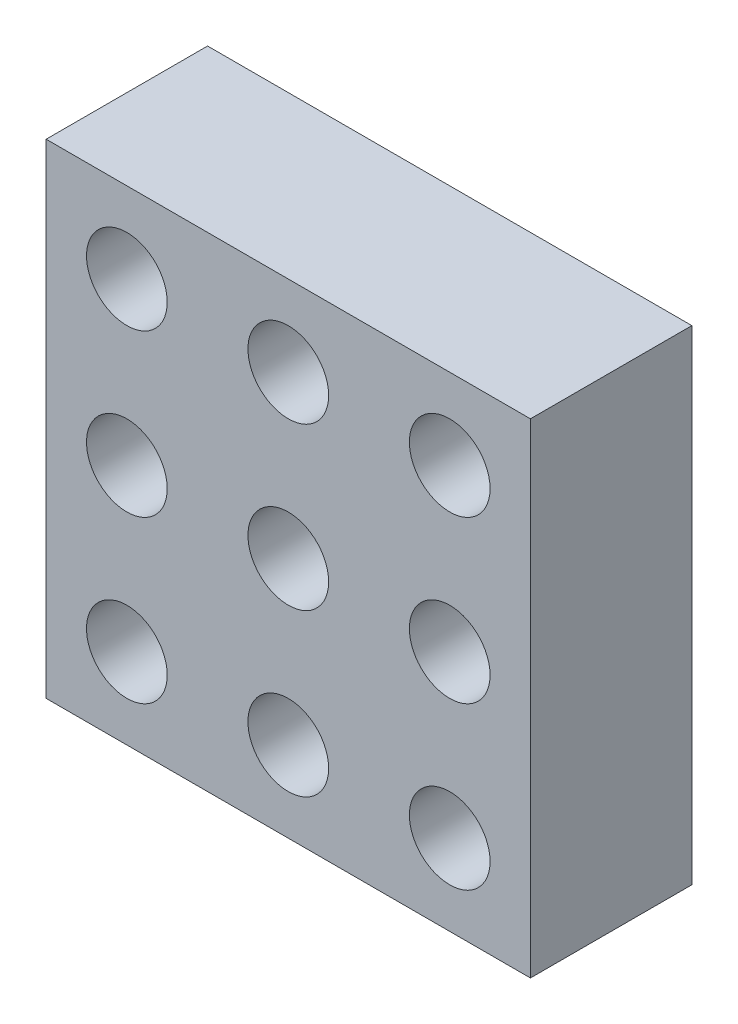
ISO-10303-21;
HEADER;
FILE_DESCRIPTION(('STEP AP214'),'2;1');
FILE_NAME('part.step','',(''),(''),'','','');
FILE_SCHEMA(('AUTOMOTIVE_DESIGN { 1 0 10303 214 1 1 1 1 }'));
ENDSEC;
DATA;
#1=APPLICATION_CONTEXT('core data for automotive mechanical design processes');
#2=APPLICATION_PROTOCOL_DEFINITION('international standard','automotive_design',2000,#1);
#3=PRODUCT_CONTEXT('',#1,'mechanical');
#4=PRODUCT('Part','Part','',(#3));
#5=PRODUCT_RELATED_PRODUCT_CATEGORY('part','',(#4));
#6=PRODUCT_DEFINITION_FORMATION('','',#4);
#7=PRODUCT_DEFINITION_CONTEXT('part definition',#1,'design');
#8=PRODUCT_DEFINITION('design','',#6,#7);
#9=PRODUCT_DEFINITION_SHAPE('','',#8);
#10=(LENGTH_UNIT() NAMED_UNIT(*) SI_UNIT(.MILLI.,.METRE.));
#11=(NAMED_UNIT(*) PLANE_ANGLE_UNIT() SI_UNIT($,.RADIAN.));
#12=(NAMED_UNIT(*) SI_UNIT($,.STERADIAN.) SOLID_ANGLE_UNIT());
#13=UNCERTAINTY_MEASURE_WITH_UNIT(LENGTH_MEASURE(1.E-05),#10,'distance_accuracy_value','');
#14=(GEOMETRIC_REPRESENTATION_CONTEXT(3) GLOBAL_UNCERTAINTY_ASSIGNED_CONTEXT((#13)) GLOBAL_UNIT_ASSIGNED_CONTEXT((#10,
#11,#12)) REPRESENTATION_CONTEXT('',''));
#15=CARTESIAN_POINT('',(0.,0.,0.));
#16=DIRECTION('',(0.,0.,1.));
#17=DIRECTION('',(1.,0.,0.));
#18=AXIS2_PLACEMENT_3D('',#15,#16,#17);
#19=CARTESIAN_POINT('',(63.5,63.5,0.));
#20=DIRECTION('',(0.,0.,1.));
#21=DIRECTION('',(1.,0.,0.));
#22=AXIS2_PLACEMENT_3D('',#19,#20,#21);
#23=CYLINDRICAL_SURFACE('',#22,6.35);
#24=CARTESIAN_POINT('',(63.5,63.5,0.));
#25=DIRECTION('',(0.,0.,1.));
#26=DIRECTION('',(1.,0.,0.));
#27=AXIS2_PLACEMENT_3D('',#24,#25,#26);
#28=CIRCLE('',#27,6.35);
#29=CARTESIAN_POINT('',(69.85,63.5,0.));
#30=VERTEX_POINT('',#29);
#31=EDGE_CURVE('E47',#30,#30,#28,.T.);
#32=ORIENTED_EDGE('',*,*,#31,.F.);
#33=EDGE_LOOP('',(#32));
#34=FACE_BOUND('',#33,.T.);
#35=CARTESIAN_POINT('',(63.5,63.5,25.4));
#36=DIRECTION('',(0.,0.,1.));
#37=DIRECTION('',(1.,0.,0.));
#38=AXIS2_PLACEMENT_3D('',#35,#36,#37);
#39=CIRCLE('',#38,6.35);
#40=CARTESIAN_POINT('',(69.85,63.5,25.4));
#41=VERTEX_POINT('',#40);
#42=EDGE_CURVE('E11',#41,#41,#39,.T.);
#43=ORIENTED_EDGE('',*,*,#42,.T.);
#44=EDGE_LOOP('',(#43));
#45=FACE_BOUND('',#44,.T.);
#46=ADVANCED_FACE('F39',(#34,#45),#23,.F.);
#47=CARTESIAN_POINT('',(63.5,38.1,0.));
#48=DIRECTION('',(0.,0.,1.));
#49=DIRECTION('',(1.,0.,0.));
#50=AXIS2_PLACEMENT_3D('',#47,#48,#49);
#51=CYLINDRICAL_SURFACE('',#50,6.35);
#52=CARTESIAN_POINT('',(63.5,38.1,0.));
#53=DIRECTION('',(0.,0.,1.));
#54=DIRECTION('',(1.,0.,0.));
#55=AXIS2_PLACEMENT_3D('',#52,#53,#54);
#56=CIRCLE('',#55,6.35);
#57=CARTESIAN_POINT('',(69.85,38.1,0.));
#58=VERTEX_POINT('',#57);
#59=EDGE_CURVE('E147',#58,#58,#56,.T.);
#60=ORIENTED_EDGE('',*,*,#59,.F.);
#61=EDGE_LOOP('',(#60));
#62=FACE_BOUND('',#61,.T.);
#63=CARTESIAN_POINT('',(63.5,38.1,25.4));
#64=DIRECTION('',(0.,0.,1.));
#65=DIRECTION('',(1.,0.,0.));
#66=AXIS2_PLACEMENT_3D('',#63,#64,#65);
#67=CIRCLE('',#66,6.35);
#68=CARTESIAN_POINT('',(69.85,38.1,25.4));
#69=VERTEX_POINT('',#68);
#70=EDGE_CURVE('E150',#69,#69,#67,.T.);
#71=ORIENTED_EDGE('',*,*,#70,.T.);
#72=EDGE_LOOP('',(#71));
#73=FACE_BOUND('',#72,.T.);
#74=ADVANCED_FACE('F159',(#62,#73),#51,.F.);
#75=CARTESIAN_POINT('',(63.5,12.7,0.));
#76=DIRECTION('',(0.,0.,1.));
#77=DIRECTION('',(1.,0.,0.));
#78=AXIS2_PLACEMENT_3D('',#75,#76,#77);
#79=CYLINDRICAL_SURFACE('',#78,6.35);
#80=CARTESIAN_POINT('',(63.5,12.7,0.));
#81=DIRECTION('',(0.,0.,1.));
#82=DIRECTION('',(1.,0.,0.));
#83=AXIS2_PLACEMENT_3D('',#80,#81,#82);
#84=CIRCLE('',#83,6.35);
#85=CARTESIAN_POINT('',(69.85,12.7,0.));
#86=VERTEX_POINT('',#85);
#87=EDGE_CURVE('E141',#86,#86,#84,.T.);
#88=ORIENTED_EDGE('',*,*,#87,.F.);
#89=EDGE_LOOP('',(#88));
#90=FACE_BOUND('',#89,.T.);
#91=CARTESIAN_POINT('',(63.5,12.7,25.4));
#92=DIRECTION('',(0.,0.,1.));
#93=DIRECTION('',(1.,0.,0.));
#94=AXIS2_PLACEMENT_3D('',#91,#92,#93);
#95=CIRCLE('',#94,6.35);
#96=CARTESIAN_POINT('',(69.85,12.7,25.4));
#97=VERTEX_POINT('',#96);
#98=EDGE_CURVE('E144',#97,#97,#95,.T.);
#99=ORIENTED_EDGE('',*,*,#98,.T.);
#100=EDGE_LOOP('',(#99));
#101=FACE_BOUND('',#100,.T.);
#102=ADVANCED_FACE('F202',(#90,#101),#79,.F.);
#103=CARTESIAN_POINT('',(38.1,63.5,0.));
#104=DIRECTION('',(0.,0.,1.));
#105=DIRECTION('',(1.,0.,0.));
#106=AXIS2_PLACEMENT_3D('',#103,#104,#105);
#107=CYLINDRICAL_SURFACE('',#106,6.35);
#108=CARTESIAN_POINT('',(38.1,63.5,0.));
#109=DIRECTION('',(0.,0.,1.));
#110=DIRECTION('',(1.,0.,0.));
#111=AXIS2_PLACEMENT_3D('',#108,#109,#110);
#112=CIRCLE('',#111,6.35);
#113=CARTESIAN_POINT('',(44.45,63.5,0.));
#114=VERTEX_POINT('',#113);
#115=EDGE_CURVE('E135',#114,#114,#112,.T.);
#116=ORIENTED_EDGE('',*,*,#115,.F.);
#117=EDGE_LOOP('',(#116));
#118=FACE_BOUND('',#117,.T.);
#119=CARTESIAN_POINT('',(38.1,63.5,25.4));
#120=DIRECTION('',(0.,0.,1.));
#121=DIRECTION('',(1.,0.,0.));
#122=AXIS2_PLACEMENT_3D('',#119,#120,#121);
#123=CIRCLE('',#122,6.35);
#124=CARTESIAN_POINT('',(44.45,63.5,25.4));
#125=VERTEX_POINT('',#124);
#126=EDGE_CURVE('E138',#125,#125,#123,.T.);
#127=ORIENTED_EDGE('',*,*,#126,.T.);
#128=EDGE_LOOP('',(#127));
#129=FACE_BOUND('',#128,.T.);
#130=ADVANCED_FACE('F198',(#118,#129),#107,.F.);
#131=CARTESIAN_POINT('',(38.1,38.1,0.));
#132=DIRECTION('',(0.,0.,1.));
#133=DIRECTION('',(1.,0.,0.));
#134=AXIS2_PLACEMENT_3D('',#131,#132,#133);
#135=CYLINDRICAL_SURFACE('',#134,6.35);
#136=CARTESIAN_POINT('',(38.1,38.1,0.));
#137=DIRECTION('',(0.,0.,1.));
#138=DIRECTION('',(1.,0.,0.));
#139=AXIS2_PLACEMENT_3D('',#136,#137,#138);
#140=CIRCLE('',#139,6.35);
#141=CARTESIAN_POINT('',(44.45,38.1,0.));
#142=VERTEX_POINT('',#141);
#143=EDGE_CURVE('E129',#142,#142,#140,.T.);
#144=ORIENTED_EDGE('',*,*,#143,.F.);
#145=EDGE_LOOP('',(#144));
#146=FACE_BOUND('',#145,.T.);
#147=CARTESIAN_POINT('',(38.1,38.1,25.4));
#148=DIRECTION('',(0.,0.,1.));
#149=DIRECTION('',(1.,0.,0.));
#150=AXIS2_PLACEMENT_3D('',#147,#148,#149);
#151=CIRCLE('',#150,6.35);
#152=CARTESIAN_POINT('',(44.45,38.1,25.4));
#153=VERTEX_POINT('',#152);
#154=EDGE_CURVE('E132',#153,#153,#151,.T.);
#155=ORIENTED_EDGE('',*,*,#154,.T.);
#156=EDGE_LOOP('',(#155));
#157=FACE_BOUND('',#156,.T.);
#158=ADVANCED_FACE('F194',(#146,#157),#135,.F.);
#159=CARTESIAN_POINT('',(38.1,12.7,0.));
#160=DIRECTION('',(0.,0.,1.));
#161=DIRECTION('',(1.,0.,0.));
#162=AXIS2_PLACEMENT_3D('',#159,#160,#161);
#163=CYLINDRICAL_SURFACE('',#162,6.35);
#164=CARTESIAN_POINT('',(38.1,12.7,0.));
#165=DIRECTION('',(0.,0.,1.));
#166=DIRECTION('',(1.,0.,0.));
#167=AXIS2_PLACEMENT_3D('',#164,#165,#166);
#168=CIRCLE('',#167,6.35);
#169=CARTESIAN_POINT('',(44.45,12.7,0.));
#170=VERTEX_POINT('',#169);
#171=EDGE_CURVE('E123',#170,#170,#168,.T.);
#172=ORIENTED_EDGE('',*,*,#171,.F.);
#173=EDGE_LOOP('',(#172));
#174=FACE_BOUND('',#173,.T.);
#175=CARTESIAN_POINT('',(38.1,12.7,25.4));
#176=DIRECTION('',(0.,0.,1.));
#177=DIRECTION('',(1.,0.,0.));
#178=AXIS2_PLACEMENT_3D('',#175,#176,#177);
#179=CIRCLE('',#178,6.35);
#180=CARTESIAN_POINT('',(44.45,12.7,25.4));
#181=VERTEX_POINT('',#180);
#182=EDGE_CURVE('E126',#181,#181,#179,.T.);
#183=ORIENTED_EDGE('',*,*,#182,.T.);
#184=EDGE_LOOP('',(#183));
#185=FACE_BOUND('',#184,.T.);
#186=ADVANCED_FACE('F190',(#174,#185),#163,.F.);
#187=CARTESIAN_POINT('',(12.7,63.5,0.));
#188=DIRECTION('',(0.,0.,1.));
#189=DIRECTION('',(1.,0.,0.));
#190=AXIS2_PLACEMENT_3D('',#187,#188,#189);
#191=CYLINDRICAL_SURFACE('',#190,6.35);
#192=CARTESIAN_POINT('',(12.7,63.5,0.));
#193=DIRECTION('',(0.,0.,1.));
#194=DIRECTION('',(1.,0.,0.));
#195=AXIS2_PLACEMENT_3D('',#192,#193,#194);
#196=CIRCLE('',#195,6.35);
#197=CARTESIAN_POINT('',(19.05,63.5,0.));
#198=VERTEX_POINT('',#197);
#199=EDGE_CURVE('E117',#198,#198,#196,.T.);
#200=ORIENTED_EDGE('',*,*,#199,.F.);
#201=EDGE_LOOP('',(#200));
#202=FACE_BOUND('',#201,.T.);
#203=CARTESIAN_POINT('',(12.7,63.5,25.4));
#204=DIRECTION('',(0.,0.,1.));
#205=DIRECTION('',(1.,0.,0.));
#206=AXIS2_PLACEMENT_3D('',#203,#204,#205);
#207=CIRCLE('',#206,6.35);
#208=CARTESIAN_POINT('',(19.05,63.5,25.4));
#209=VERTEX_POINT('',#208);
#210=EDGE_CURVE('E120',#209,#209,#207,.T.);
#211=ORIENTED_EDGE('',*,*,#210,.T.);
#212=EDGE_LOOP('',(#211));
#213=FACE_BOUND('',#212,.T.);
#214=ADVANCED_FACE('F187',(#202,#213),#191,.F.);
#215=CARTESIAN_POINT('',(0.,0.,25.4));
#216=DIRECTION('',(1.,0.,0.));
#217=DIRECTION('',(0.,0.,-1.));
#218=AXIS2_PLACEMENT_3D('',#215,#216,#217);
#219=PLANE('',#218);
#220=DIRECTION('',(0.,-1.,0.));
#221=VECTOR('',#220,1.);
#222=CARTESIAN_POINT('',(0.,0.,0.));
#223=LINE('',#222,#221);
#224=CARTESIAN_POINT('',(0.,76.2,0.));
#225=VERTEX_POINT('',#224);
#226=CARTESIAN_POINT('',(0.,0.,0.));
#227=VERTEX_POINT('',#226);
#228=EDGE_CURVE('E107',#225,#227,#223,.T.);
#229=ORIENTED_EDGE('',*,*,#228,.T.);
#230=DIRECTION('',(0.,0.,-1.));
#231=VECTOR('',#230,1.);
#232=CARTESIAN_POINT('',(0.,0.,25.4));
#233=LINE('',#232,#231);
#234=CARTESIAN_POINT('',(0.,0.,25.4));
#235=VERTEX_POINT('',#234);
#236=EDGE_CURVE('E98',#235,#227,#233,.T.);
#237=ORIENTED_EDGE('',*,*,#236,.F.);
#238=DIRECTION('',(0.,-1.,0.));
#239=VECTOR('',#238,1.);
#240=CARTESIAN_POINT('',(0.,0.,25.4));
#241=LINE('',#240,#239);
#242=CARTESIAN_POINT('',(0.,76.2,25.4));
#243=VERTEX_POINT('',#242);
#244=EDGE_CURVE('E92',#243,#235,#241,.T.);
#245=ORIENTED_EDGE('',*,*,#244,.F.);
#246=DIRECTION('',(0.,0.,-1.));
#247=VECTOR('',#246,1.);
#248=CARTESIAN_POINT('',(0.,76.2,25.4));
#249=LINE('',#248,#247);
#250=EDGE_CURVE('E103',#243,#225,#249,.T.);
#251=ORIENTED_EDGE('',*,*,#250,.T.);
#252=EDGE_LOOP('',(#229,#237,#245,#251));
#253=FACE_BOUND('',#252,.T.);
#254=ADVANCED_FACE('F184',(#253),#219,.F.);
#255=CARTESIAN_POINT('',(0.,0.,25.4));
#256=DIRECTION('',(0.,1.,0.));
#257=DIRECTION('',(0.,0.,1.));
#258=AXIS2_PLACEMENT_3D('',#255,#256,#257);
#259=PLANE('',#258);
#260=DIRECTION('',(1.,0.,0.));
#261=VECTOR('',#260,1.);
#262=CARTESIAN_POINT('',(0.,0.,0.));
#263=LINE('',#262,#261);
#264=CARTESIAN_POINT('',(76.2,0.,0.));
#265=VERTEX_POINT('',#264);
#266=EDGE_CURVE('E97',#227,#265,#263,.T.);
#267=ORIENTED_EDGE('',*,*,#266,.T.);
#268=DIRECTION('',(0.,0.,-1.));
#269=VECTOR('',#268,1.);
#270=CARTESIAN_POINT('',(76.2,0.,25.4));
#271=LINE('',#270,#269);
#272=CARTESIAN_POINT('',(76.2,0.,25.4));
#273=VERTEX_POINT('',#272);
#274=EDGE_CURVE('E95',#273,#265,#271,.T.);
#275=ORIENTED_EDGE('',*,*,#274,.F.);
#276=DIRECTION('',(1.,0.,0.));
#277=VECTOR('',#276,1.);
#278=CARTESIAN_POINT('',(0.,0.,25.4));
#279=LINE('',#278,#277);
#280=EDGE_CURVE('E86',#235,#273,#279,.T.);
#281=ORIENTED_EDGE('',*,*,#280,.F.);
#282=ORIENTED_EDGE('',*,*,#236,.T.);
#283=EDGE_LOOP('',(#267,#275,#281,#282));
#284=FACE_BOUND('',#283,.T.);
#285=ADVANCED_FACE('F96',(#284),#259,.F.);
#286=CARTESIAN_POINT('',(76.2,0.,25.4));
#287=DIRECTION('',(-1.,0.,0.));
#288=DIRECTION('',(0.,0.,1.));
#289=AXIS2_PLACEMENT_3D('',#286,#287,#288);
#290=PLANE('',#289);
#291=DIRECTION('',(0.,1.,0.));
#292=VECTOR('',#291,1.);
#293=CARTESIAN_POINT('',(76.2,0.,0.));
#294=LINE('',#293,#292);
#295=CARTESIAN_POINT('',(76.2,76.2,0.));
#296=VERTEX_POINT('',#295);
#297=EDGE_CURVE('E72',#265,#296,#294,.T.);
#298=ORIENTED_EDGE('',*,*,#297,.T.);
#299=DIRECTION('',(0.,0.,-1.));
#300=VECTOR('',#299,1.);
#301=CARTESIAN_POINT('',(76.2,76.2,25.4));
#302=LINE('',#301,#300);
#303=CARTESIAN_POINT('',(76.2,76.2,25.4));
#304=VERTEX_POINT('',#303);
#305=EDGE_CURVE('E99',#304,#296,#302,.T.);
#306=ORIENTED_EDGE('',*,*,#305,.F.);
#307=DIRECTION('',(0.,1.,0.));
#308=VECTOR('',#307,1.);
#309=CARTESIAN_POINT('',(76.2,0.,25.4));
#310=LINE('',#309,#308);
#311=EDGE_CURVE('E90',#273,#304,#310,.T.);
#312=ORIENTED_EDGE('',*,*,#311,.F.);
#313=ORIENTED_EDGE('',*,*,#274,.T.);
#314=EDGE_LOOP('',(#298,#306,#312,#313));
#315=FACE_BOUND('',#314,.T.);
#316=ADVANCED_FACE('F101',(#315),#290,.F.);
#317=CARTESIAN_POINT('',(0.,76.2,25.4));
#318=DIRECTION('',(0.,-1.,0.));
#319=DIRECTION('',(0.,0.,-1.));
#320=AXIS2_PLACEMENT_3D('',#317,#318,#319);
#321=PLANE('',#320);
#322=DIRECTION('',(-1.,0.,0.));
#323=VECTOR('',#322,1.);
#324=CARTESIAN_POINT('',(0.,76.2,0.));
#325=LINE('',#324,#323);
#326=EDGE_CURVE('E78',#296,#225,#325,.T.);
#327=ORIENTED_EDGE('',*,*,#326,.T.);
#328=ORIENTED_EDGE('',*,*,#250,.F.);
#329=DIRECTION('',(-1.,0.,0.));
#330=VECTOR('',#329,1.);
#331=CARTESIAN_POINT('',(0.,76.2,25.4));
#332=LINE('',#331,#330);
#333=EDGE_CURVE('E55',#304,#243,#332,.T.);
#334=ORIENTED_EDGE('',*,*,#333,.F.);
#335=ORIENTED_EDGE('',*,*,#305,.T.);
#336=EDGE_LOOP('',(#327,#328,#334,#335));
#337=FACE_BOUND('',#336,.T.);
#338=ADVANCED_FACE('F163',(#337),#321,.F.);
#339=CARTESIAN_POINT('',(0.,0.,25.4));
#340=DIRECTION('',(0.,0.,-1.));
#341=DIRECTION('',(-1.,0.,0.));
#342=AXIS2_PLACEMENT_3D('',#339,#340,#341);
#343=PLANE('',#342);
#344=CARTESIAN_POINT('',(12.7,38.1,25.4));
#345=DIRECTION('',(0.,0.,1.));
#346=DIRECTION('',(1.,0.,0.));
#347=AXIS2_PLACEMENT_3D('',#344,#345,#346);
#348=CIRCLE('',#347,6.35);
#349=CARTESIAN_POINT('',(19.05,38.1,25.4));
#350=VERTEX_POINT('',#349);
#351=EDGE_CURVE('E312',#350,#350,#348,.T.);
#352=ORIENTED_EDGE('',*,*,#351,.F.);
#353=EDGE_LOOP('',(#352));
#354=FACE_BOUND('',#353,.T.);
#355=CARTESIAN_POINT('',(12.7,12.7,25.4));
#356=DIRECTION('',(0.,0.,1.));
#357=DIRECTION('',(1.,0.,0.));
#358=AXIS2_PLACEMENT_3D('',#355,#356,#357);
#359=CIRCLE('',#358,6.35);
#360=CARTESIAN_POINT('',(19.05,12.7,25.4));
#361=VERTEX_POINT('',#360);
#362=EDGE_CURVE('E311',#361,#361,#359,.T.);
#363=ORIENTED_EDGE('',*,*,#362,.F.);
#364=EDGE_LOOP('',(#363));
#365=FACE_BOUND('',#364,.T.);
#366=ORIENTED_EDGE('',*,*,#244,.T.);
#367=ORIENTED_EDGE('',*,*,#280,.T.);
#368=ORIENTED_EDGE('',*,*,#311,.T.);
#369=ORIENTED_EDGE('',*,*,#333,.T.);
#370=EDGE_LOOP('',(#366,#367,#368,#369));
#371=FACE_BOUND('',#370,.T.);
#372=ORIENTED_EDGE('',*,*,#210,.F.);
#373=EDGE_LOOP('',(#372));
#374=FACE_BOUND('',#373,.T.);
#375=ORIENTED_EDGE('',*,*,#182,.F.);
#376=EDGE_LOOP('',(#375));
#377=FACE_BOUND('',#376,.T.);
#378=ORIENTED_EDGE('',*,*,#154,.F.);
#379=EDGE_LOOP('',(#378));
#380=FACE_BOUND('',#379,.T.);
#381=ORIENTED_EDGE('',*,*,#126,.F.);
#382=EDGE_LOOP('',(#381));
#383=FACE_BOUND('',#382,.T.);
#384=ORIENTED_EDGE('',*,*,#98,.F.);
#385=EDGE_LOOP('',(#384));
#386=FACE_BOUND('',#385,.T.);
#387=ORIENTED_EDGE('',*,*,#70,.F.);
#388=EDGE_LOOP('',(#387));
#389=FACE_BOUND('',#388,.T.);
#390=ORIENTED_EDGE('',*,*,#42,.F.);
#391=EDGE_LOOP('',(#390));
#392=FACE_BOUND('',#391,.T.);
#393=ADVANCED_FACE('F87',(#354,#365,#371,#374,#377,#380,#383,#386,#389,#392),#343,.F.);
#394=CARTESIAN_POINT('',(0.,0.,0.));
#395=DIRECTION('',(0.,0.,-1.));
#396=DIRECTION('',(-1.,0.,0.));
#397=AXIS2_PLACEMENT_3D('',#394,#395,#396);
#398=PLANE('',#397);
#399=CARTESIAN_POINT('',(12.7,38.1,0.));
#400=DIRECTION('',(0.,0.,1.));
#401=DIRECTION('',(1.,0.,0.));
#402=AXIS2_PLACEMENT_3D('',#399,#400,#401);
#403=CIRCLE('',#402,6.35);
#404=CARTESIAN_POINT('',(19.05,38.1,0.));
#405=VERTEX_POINT('',#404);
#406=EDGE_CURVE('E316',#405,#405,#403,.T.);
#407=ORIENTED_EDGE('',*,*,#406,.T.);
#408=EDGE_LOOP('',(#407));
#409=FACE_BOUND('',#408,.T.);
#410=CARTESIAN_POINT('',(12.7,12.7,0.));
#411=DIRECTION('',(0.,0.,1.));
#412=DIRECTION('',(1.,0.,0.));
#413=AXIS2_PLACEMENT_3D('',#410,#411,#412);
#414=CIRCLE('',#413,6.35);
#415=CARTESIAN_POINT('',(19.05,12.7,0.));
#416=VERTEX_POINT('',#415);
#417=EDGE_CURVE('E110',#416,#416,#414,.T.);
#418=ORIENTED_EDGE('',*,*,#417,.T.);
#419=EDGE_LOOP('',(#418));
#420=FACE_BOUND('',#419,.T.);
#421=ORIENTED_EDGE('',*,*,#228,.F.);
#422=ORIENTED_EDGE('',*,*,#326,.F.);
#423=ORIENTED_EDGE('',*,*,#297,.F.);
#424=ORIENTED_EDGE('',*,*,#266,.F.);
#425=EDGE_LOOP('',(#421,#422,#423,#424));
#426=FACE_BOUND('',#425,.T.);
#427=ORIENTED_EDGE('',*,*,#199,.T.);
#428=EDGE_LOOP('',(#427));
#429=FACE_BOUND('',#428,.T.);
#430=ORIENTED_EDGE('',*,*,#171,.T.);
#431=EDGE_LOOP('',(#430));
#432=FACE_BOUND('',#431,.T.);
#433=ORIENTED_EDGE('',*,*,#143,.T.);
#434=EDGE_LOOP('',(#433));
#435=FACE_BOUND('',#434,.T.);
#436=ORIENTED_EDGE('',*,*,#115,.T.);
#437=EDGE_LOOP('',(#436));
#438=FACE_BOUND('',#437,.T.);
#439=ORIENTED_EDGE('',*,*,#87,.T.);
#440=EDGE_LOOP('',(#439));
#441=FACE_BOUND('',#440,.T.);
#442=ORIENTED_EDGE('',*,*,#59,.T.);
#443=EDGE_LOOP('',(#442));
#444=FACE_BOUND('',#443,.T.);
#445=ORIENTED_EDGE('',*,*,#31,.T.);
#446=EDGE_LOOP('',(#445));
#447=FACE_BOUND('',#446,.T.);
#448=ADVANCED_FACE('F155',(#409,#420,#426,#429,#432,#435,#438,#441,#444,#447),#398,.T.);
#449=CARTESIAN_POINT('',(12.7,12.7,0.));
#450=DIRECTION('',(0.,0.,1.));
#451=DIRECTION('',(1.,0.,0.));
#452=AXIS2_PLACEMENT_3D('',#449,#450,#451);
#453=CYLINDRICAL_SURFACE('',#452,6.35);
#454=ORIENTED_EDGE('',*,*,#417,.F.);
#455=EDGE_LOOP('',(#454));
#456=FACE_BOUND('',#455,.T.);
#457=ORIENTED_EDGE('',*,*,#362,.T.);
#458=EDGE_LOOP('',(#457));
#459=FACE_BOUND('',#458,.T.);
#460=ADVANCED_FACE('F170',(#456,#459),#453,.F.);
#461=CARTESIAN_POINT('',(12.7,38.1,0.));
#462=DIRECTION('',(0.,0.,1.));
#463=DIRECTION('',(1.,0.,0.));
#464=AXIS2_PLACEMENT_3D('',#461,#462,#463);
#465=CYLINDRICAL_SURFACE('',#464,6.35);
#466=ORIENTED_EDGE('',*,*,#406,.F.);
#467=EDGE_LOOP('',(#466));
#468=FACE_BOUND('',#467,.T.);
#469=ORIENTED_EDGE('',*,*,#351,.T.);
#470=EDGE_LOOP('',(#469));
#471=FACE_BOUND('',#470,.T.);
#472=ADVANCED_FACE('F249',(#468,#471),#465,.F.);
#473=CLOSED_SHELL('',(#46,#74,#102,#130,#158,#186,#214,#254,#285,#316,#338,#393,#448,#460,#472));
#474=MANIFOLD_SOLID_BREP('B2',#473);
#475=ADVANCED_BREP_SHAPE_REPRESENTATION('',(#18,#474),#14);
#476=SHAPE_DEFINITION_REPRESENTATION(#9,#475);
ENDSEC;
END-ISO-10303-21;
